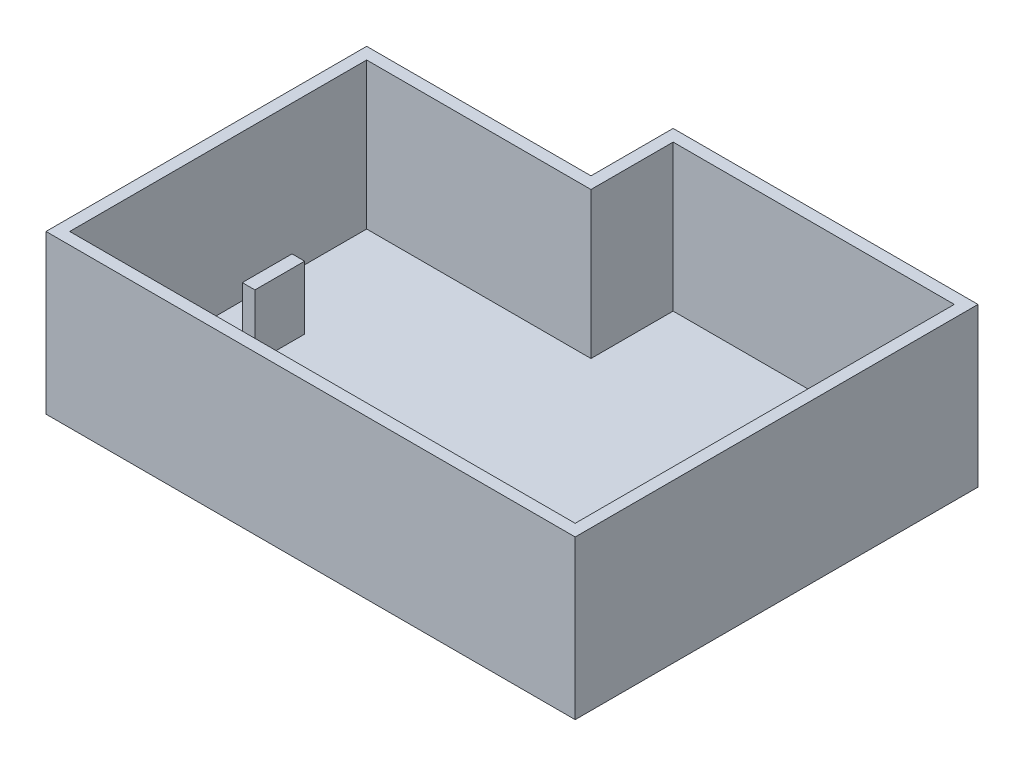
ISO-10303-21;
HEADER;
FILE_DESCRIPTION(('STEP AP214'),'2;1');
FILE_NAME('part.step','',(''),(''),'','','');
FILE_SCHEMA(('AUTOMOTIVE_DESIGN { 1 0 10303 214 1 1 1 1 }'));
ENDSEC;
DATA;
#1=APPLICATION_CONTEXT('core data for automotive mechanical design processes');
#2=APPLICATION_PROTOCOL_DEFINITION('international standard','automotive_design',2000,#1);
#3=PRODUCT_CONTEXT('',#1,'mechanical');
#4=PRODUCT('Part','Part','',(#3));
#5=PRODUCT_RELATED_PRODUCT_CATEGORY('part','',(#4));
#6=PRODUCT_DEFINITION_FORMATION('','',#4);
#7=PRODUCT_DEFINITION_CONTEXT('part definition',#1,'design');
#8=PRODUCT_DEFINITION('design','',#6,#7);
#9=PRODUCT_DEFINITION_SHAPE('','',#8);
#10=(LENGTH_UNIT() NAMED_UNIT(*) SI_UNIT(.MILLI.,.METRE.));
#11=(NAMED_UNIT(*) PLANE_ANGLE_UNIT() SI_UNIT($,.RADIAN.));
#12=(NAMED_UNIT(*) SI_UNIT($,.STERADIAN.) SOLID_ANGLE_UNIT());
#13=UNCERTAINTY_MEASURE_WITH_UNIT(LENGTH_MEASURE(1.E-05),#10,'distance_accuracy_value','');
#14=(GEOMETRIC_REPRESENTATION_CONTEXT(3) GLOBAL_UNCERTAINTY_ASSIGNED_CONTEXT((#13)) GLOBAL_UNIT_ASSIGNED_CONTEXT((#10,
#11,#12)) REPRESENTATION_CONTEXT('',''));
#15=CARTESIAN_POINT('',(0.,0.,0.));
#16=DIRECTION('',(0.,0.,1.));
#17=DIRECTION('',(1.,0.,0.));
#18=AXIS2_PLACEMENT_3D('',#15,#16,#17);
#19=CARTESIAN_POINT('',(212.725,4.7625,0.));
#20=DIRECTION('',(0.,1.,0.));
#21=DIRECTION('',(0.,0.,1.));
#22=AXIS2_PLACEMENT_3D('',#19,#20,#21);
#23=PLANE('',#22);
#24=DIRECTION('',(1.,0.,0.));
#25=VECTOR('',#24,1.);
#26=CARTESIAN_POINT('',(212.725,4.7625,-10.));
#27=LINE('',#26,#25);
#28=CARTESIAN_POINT('',(290.195,4.7625,-10.));
#29=VERTEX_POINT('',#28);
#30=CARTESIAN_POINT('',(295.275,4.7625,-10.));
#31=VERTEX_POINT('',#30);
#32=EDGE_CURVE('E162',#29,#31,#27,.T.);
#33=ORIENTED_EDGE('',*,*,#32,.T.);
#34=DIRECTION('',(0.,0.,-1.));
#35=VECTOR('',#34,1.);
#36=CARTESIAN_POINT('',(295.275,4.7625,0.));
#37=LINE('',#36,#35);
#38=CARTESIAN_POINT('',(295.275,4.7625,9.99999999999997));
#39=VERTEX_POINT('',#38);
#40=EDGE_CURVE('E169',#39,#31,#37,.T.);
#41=ORIENTED_EDGE('',*,*,#40,.F.);
#42=DIRECTION('',(1.,0.,0.));
#43=VECTOR('',#42,1.);
#44=CARTESIAN_POINT('',(212.725,4.7625,9.99999999999994));
#45=LINE('',#44,#43);
#46=CARTESIAN_POINT('',(290.195,4.7625,9.99999999999997));
#47=VERTEX_POINT('',#46);
#48=EDGE_CURVE('E166',#47,#39,#45,.T.);
#49=ORIENTED_EDGE('',*,*,#48,.F.);
#50=DIRECTION('',(0.,0.,-1.));
#51=VECTOR('',#50,1.);
#52=CARTESIAN_POINT('',(290.195,4.7625,-17.8901525748163));
#53=LINE('',#52,#51);
#54=EDGE_CURVE('E295',#47,#29,#53,.T.);
#55=ORIENTED_EDGE('',*,*,#54,.T.);
#56=EDGE_LOOP('',(#33,#41,#49,#55));
#57=FACE_BOUND('',#56,.T.);
#58=DIRECTION('',(-1.,0.,0.));
#59=VECTOR('',#58,1.);
#60=CARTESIAN_POINT('',(212.725,4.7625,38.575));
#61=LINE('',#60,#59);
#62=CARTESIAN_POINT('',(135.255,4.7625,38.575));
#63=VERTEX_POINT('',#62);
#64=CARTESIAN_POINT('',(130.175,4.7625,38.575));
#65=VERTEX_POINT('',#64);
#66=EDGE_CURVE('E232',#63,#65,#61,.T.);
#67=ORIENTED_EDGE('',*,*,#66,.T.);
#68=DIRECTION('',(0.,0.,-1.));
#69=VECTOR('',#68,1.);
#70=CARTESIAN_POINT('',(130.175,4.7625,0.));
#71=LINE('',#70,#69);
#72=CARTESIAN_POINT('',(130.175,4.7625,18.575));
#73=VERTEX_POINT('',#72);
#74=EDGE_CURVE('E229',#65,#73,#71,.T.);
#75=ORIENTED_EDGE('',*,*,#74,.T.);
#76=DIRECTION('',(-1.,0.,0.));
#77=VECTOR('',#76,1.);
#78=CARTESIAN_POINT('',(212.725,4.7625,18.5749999999999));
#79=LINE('',#78,#77);
#80=CARTESIAN_POINT('',(135.255,4.7625,18.575));
#81=VERTEX_POINT('',#80);
#82=EDGE_CURVE('E225',#81,#73,#79,.T.);
#83=ORIENTED_EDGE('',*,*,#82,.F.);
#84=DIRECTION('',(0.,0.,1.));
#85=VECTOR('',#84,1.);
#86=CARTESIAN_POINT('',(135.255,4.7625,-17.8901525748163));
#87=LINE('',#86,#85);
#88=EDGE_CURVE('E298',#81,#63,#87,.T.);
#89=ORIENTED_EDGE('',*,*,#88,.T.);
#90=EDGE_LOOP('',(#67,#75,#83,#89));
#91=FACE_BOUND('',#90,.T.);
#92=DIRECTION('',(0.,0.,-1.));
#93=VECTOR('',#92,1.);
#94=CARTESIAN_POINT('',(222.725,4.7625,0.));
#95=LINE('',#94,#93);
#96=CARTESIAN_POINT('',(222.725,4.7625,69.85));
#97=VERTEX_POINT('',#96);
#98=CARTESIAN_POINT('',(222.725,4.7625,64.77));
#99=VERTEX_POINT('',#98);
#100=EDGE_CURVE('E193',#97,#99,#95,.T.);
#101=ORIENTED_EDGE('',*,*,#100,.F.);
#102=DIRECTION('',(-1.,0.,0.));
#103=VECTOR('',#102,1.);
#104=CARTESIAN_POINT('',(212.725,4.7625,69.85));
#105=LINE('',#104,#103);
#106=CARTESIAN_POINT('',(202.725,4.7625,69.85));
#107=VERTEX_POINT('',#106);
#108=EDGE_CURVE('E200',#97,#107,#105,.T.);
#109=ORIENTED_EDGE('',*,*,#108,.T.);
#110=DIRECTION('',(0.,0.,-1.));
#111=VECTOR('',#110,1.);
#112=CARTESIAN_POINT('',(202.725,4.7625,0.));
#113=LINE('',#112,#111);
#114=CARTESIAN_POINT('',(202.725,4.7625,64.77));
#115=VERTEX_POINT('',#114);
#116=EDGE_CURVE('E197',#107,#115,#113,.T.);
#117=ORIENTED_EDGE('',*,*,#116,.T.);
#118=DIRECTION('',(1.,0.,0.));
#119=VECTOR('',#118,1.);
#120=CARTESIAN_POINT('',(290.195,4.7625,64.77));
#121=LINE('',#120,#119);
#122=EDGE_CURVE('E284',#115,#99,#121,.T.);
#123=ORIENTED_EDGE('',*,*,#122,.T.);
#124=EDGE_LOOP('',(#101,#109,#117,#123));
#125=FACE_BOUND('',#124,.T.);
#126=DIRECTION('',(0.,0.,1.));
#127=VECTOR('',#126,1.);
#128=CARTESIAN_POINT('',(201.295,4.7625,0.));
#129=LINE('',#128,#127);
#130=CARTESIAN_POINT('',(201.295,4.7625,-63.5));
#131=VERTEX_POINT('',#130);
#132=CARTESIAN_POINT('',(201.295,4.7625,-30.48));
#133=VERTEX_POINT('',#132);
#134=EDGE_CURVE('E248',#131,#133,#129,.T.);
#135=ORIENTED_EDGE('',*,*,#134,.T.);
#136=DIRECTION('',(-1.,0.,0.));
#137=VECTOR('',#136,1.);
#138=CARTESIAN_POINT('',(212.725,4.7625,-30.48));
#139=LINE('',#138,#137);
#140=CARTESIAN_POINT('',(111.125,4.7625,-30.48));
#141=VERTEX_POINT('',#140);
#142=EDGE_CURVE('E235',#133,#141,#139,.T.);
#143=ORIENTED_EDGE('',*,*,#142,.T.);
#144=DIRECTION('',(0.,0.,-1.));
#145=VECTOR('',#144,1.);
#146=CARTESIAN_POINT('',(111.125,4.7625,0.));
#147=LINE('',#146,#145);
#148=CARTESIAN_POINT('',(111.125,4.7625,88.9));
#149=VERTEX_POINT('',#148);
#150=EDGE_CURVE('E133',#149,#141,#147,.T.);
#151=ORIENTED_EDGE('',*,*,#150,.F.);
#152=DIRECTION('',(-1.,0.,0.));
#153=VECTOR('',#152,1.);
#154=CARTESIAN_POINT('',(212.725,4.7625,88.9));
#155=LINE('',#154,#153);
#156=CARTESIAN_POINT('',(314.325,4.7625,88.9));
#157=VERTEX_POINT('',#156);
#158=EDGE_CURVE('E136',#157,#149,#155,.T.);
#159=ORIENTED_EDGE('',*,*,#158,.F.);
#160=DIRECTION('',(0.,0.,-1.));
#161=VECTOR('',#160,1.);
#162=CARTESIAN_POINT('',(314.325,4.7625,0.));
#163=LINE('',#162,#161);
#164=CARTESIAN_POINT('',(314.325,4.7625,-63.5));
#165=VERTEX_POINT('',#164);
#166=EDGE_CURVE('E141',#157,#165,#163,.T.);
#167=ORIENTED_EDGE('',*,*,#166,.T.);
#168=DIRECTION('',(-1.,0.,0.));
#169=VECTOR('',#168,1.);
#170=CARTESIAN_POINT('',(212.725,4.7625,-63.5));
#171=LINE('',#170,#169);
#172=EDGE_CURVE('E146',#165,#131,#171,.T.);
#173=ORIENTED_EDGE('',*,*,#172,.T.);
#174=EDGE_LOOP('',(#135,#143,#151,#159,#167,#173));
#175=FACE_BOUND('',#174,.T.);
#176=ADVANCED_FACE('F40',(#57,#91,#125,#175),#23,.T.);
#177=CARTESIAN_POINT('',(212.725,63.607999784,0.));
#178=DIRECTION('',(0.,1.,0.));
#179=DIRECTION('',(0.,0.,1.));
#180=AXIS2_PLACEMENT_3D('',#177,#178,#179);
#181=PLANE('',#180);
#182=DIRECTION('',(0.,0.,-1.));
#183=VECTOR('',#182,1.);
#184=CARTESIAN_POINT('',(196.5325,63.607999784,-93.6625));
#185=LINE('',#184,#183);
#186=CARTESIAN_POINT('',(196.5325,63.607999784,-35.2425));
#187=VERTEX_POINT('',#186);
#188=CARTESIAN_POINT('',(196.5325,63.607999784,-68.2625));
#189=VERTEX_POINT('',#188);
#190=EDGE_CURVE('E251',#187,#189,#185,.T.);
#191=ORIENTED_EDGE('',*,*,#190,.F.);
#192=DIRECTION('',(1.,0.,0.));
#193=VECTOR('',#192,1.);
#194=CARTESIAN_POINT('',(196.5325,63.607999784,-35.2425));
#195=LINE('',#194,#193);
#196=CARTESIAN_POINT('',(106.3625,63.607999784,-35.2425));
#197=VERTEX_POINT('',#196);
#198=EDGE_CURVE('E268',#197,#187,#195,.T.);
#199=ORIENTED_EDGE('',*,*,#198,.F.);
#200=DIRECTION('',(0.,0.,-1.));
#201=VECTOR('',#200,1.);
#202=CARTESIAN_POINT('',(106.3625,63.607999784,0.));
#203=LINE('',#202,#201);
#204=CARTESIAN_POINT('',(106.3625,63.607999784,93.6625));
#205=VERTEX_POINT('',#204);
#206=EDGE_CURVE('E82',#205,#197,#203,.T.);
#207=ORIENTED_EDGE('',*,*,#206,.F.);
#208=DIRECTION('',(-1.,0.,0.));
#209=VECTOR('',#208,1.);
#210=CARTESIAN_POINT('',(212.725,63.607999784,93.6625));
#211=LINE('',#210,#209);
#212=CARTESIAN_POINT('',(319.0875,63.607999784,93.6625));
#213=VERTEX_POINT('',#212);
#214=EDGE_CURVE('E80',#213,#205,#211,.T.);
#215=ORIENTED_EDGE('',*,*,#214,.F.);
#216=DIRECTION('',(0.,0.,-1.));
#217=VECTOR('',#216,1.);
#218=CARTESIAN_POINT('',(319.0875,63.607999784,0.));
#219=LINE('',#218,#217);
#220=CARTESIAN_POINT('',(319.0875,63.607999784,-68.2625));
#221=VERTEX_POINT('',#220);
#222=EDGE_CURVE('E94',#213,#221,#219,.T.);
#223=ORIENTED_EDGE('',*,*,#222,.T.);
#224=DIRECTION('',(1.,0.,0.));
#225=VECTOR('',#224,1.);
#226=CARTESIAN_POINT('',(319.0875,63.607999784,-68.2625));
#227=LINE('',#226,#225);
#228=EDGE_CURVE('E288',#189,#221,#227,.T.);
#229=ORIENTED_EDGE('',*,*,#228,.F.);
#230=EDGE_LOOP('',(#191,#199,#207,#215,#223,#229));
#231=FACE_BOUND('',#230,.T.);
#232=DIRECTION('',(-1.,0.,0.));
#233=VECTOR('',#232,1.);
#234=CARTESIAN_POINT('',(319.0875,63.607999784,-63.5));
#235=LINE('',#234,#233);
#236=CARTESIAN_POINT('',(314.325,63.607999784,-63.5));
#237=VERTEX_POINT('',#236);
#238=CARTESIAN_POINT('',(201.295,63.607999784,-63.5));
#239=VERTEX_POINT('',#238);
#240=EDGE_CURVE('E281',#237,#239,#235,.T.);
#241=ORIENTED_EDGE('',*,*,#240,.F.);
#242=DIRECTION('',(0.,0.,-1.));
#243=VECTOR('',#242,1.);
#244=CARTESIAN_POINT('',(314.325,63.607999784,0.));
#245=LINE('',#244,#243);
#246=CARTESIAN_POINT('',(314.325,63.607999784,88.9));
#247=VERTEX_POINT('',#246);
#248=EDGE_CURVE('E130',#247,#237,#245,.T.);
#249=ORIENTED_EDGE('',*,*,#248,.F.);
#250=DIRECTION('',(-1.,0.,0.));
#251=VECTOR('',#250,1.);
#252=CARTESIAN_POINT('',(212.725,63.607999784,88.9));
#253=LINE('',#252,#251);
#254=CARTESIAN_POINT('',(111.125,63.607999784,88.9));
#255=VERTEX_POINT('',#254);
#256=EDGE_CURVE('E127',#247,#255,#253,.T.);
#257=ORIENTED_EDGE('',*,*,#256,.T.);
#258=DIRECTION('',(0.,0.,-1.));
#259=VECTOR('',#258,1.);
#260=CARTESIAN_POINT('',(111.125,63.607999784,0.));
#261=LINE('',#260,#259);
#262=CARTESIAN_POINT('',(111.125,63.607999784,-30.48));
#263=VERTEX_POINT('',#262);
#264=EDGE_CURVE('E123',#255,#263,#261,.T.);
#265=ORIENTED_EDGE('',*,*,#264,.T.);
#266=DIRECTION('',(-1.,0.,0.));
#267=VECTOR('',#266,1.);
#268=CARTESIAN_POINT('',(106.3625,63.607999784,-30.48));
#269=LINE('',#268,#267);
#270=CARTESIAN_POINT('',(201.295,63.607999784,-30.48));
#271=VERTEX_POINT('',#270);
#272=EDGE_CURVE('E265',#271,#263,#269,.T.);
#273=ORIENTED_EDGE('',*,*,#272,.F.);
#274=DIRECTION('',(0.,0.,1.));
#275=VECTOR('',#274,1.);
#276=CARTESIAN_POINT('',(201.295,63.607999784,-30.48));
#277=LINE('',#276,#275);
#278=EDGE_CURVE('E262',#239,#271,#277,.T.);
#279=ORIENTED_EDGE('',*,*,#278,.F.);
#280=EDGE_LOOP('',(#241,#249,#257,#265,#273,#279));
#281=FACE_BOUND('',#280,.T.);
#282=ADVANCED_FACE('F118',(#231,#281),#181,.T.);
#283=CARTESIAN_POINT('',(319.0875,63.607999784,0.));
#284=DIRECTION('',(1.,0.,0.));
#285=DIRECTION('',(0.,0.,1.));
#286=AXIS2_PLACEMENT_3D('',#283,#284,#285);
#287=PLANE('',#286);
#288=ORIENTED_EDGE('',*,*,#222,.F.);
#289=DIRECTION('',(0.,-1.,0.));
#290=VECTOR('',#289,1.);
#291=CARTESIAN_POINT('',(319.0875,63.607999784,93.6625));
#292=LINE('',#291,#290);
#293=CARTESIAN_POINT('',(319.0875,0.,93.6625));
#294=VERTEX_POINT('',#293);
#295=EDGE_CURVE('E48',#213,#294,#292,.T.);
#296=ORIENTED_EDGE('',*,*,#295,.T.);
#297=DIRECTION('',(0.,0.,-1.));
#298=VECTOR('',#297,1.);
#299=CARTESIAN_POINT('',(319.0875,0.,0.));
#300=LINE('',#299,#298);
#301=CARTESIAN_POINT('',(319.0875,0.,-68.2625));
#302=VERTEX_POINT('',#301);
#303=EDGE_CURVE('E99',#294,#302,#300,.T.);
#304=ORIENTED_EDGE('',*,*,#303,.T.);
#305=DIRECTION('',(0.,-1.,0.));
#306=VECTOR('',#305,1.);
#307=CARTESIAN_POINT('',(319.0875,186.255500497427,-68.2625));
#308=LINE('',#307,#306);
#309=EDGE_CURVE('E112',#221,#302,#308,.T.);
#310=ORIENTED_EDGE('',*,*,#309,.F.);
#311=EDGE_LOOP('',(#288,#296,#304,#310));
#312=FACE_BOUND('',#311,.T.);
#313=ADVANCED_FACE('F42',(#312),#287,.T.);
#314=CARTESIAN_POINT('',(212.725,0.,0.));
#315=DIRECTION('',(0.,1.,0.));
#316=DIRECTION('',(0.,0.,1.));
#317=AXIS2_PLACEMENT_3D('',#314,#315,#316);
#318=PLANE('',#317);
#319=ORIENTED_EDGE('',*,*,#303,.F.);
#320=DIRECTION('',(-1.,0.,0.));
#321=VECTOR('',#320,1.);
#322=CARTESIAN_POINT('',(212.725,0.,93.6625));
#323=LINE('',#322,#321);
#324=CARTESIAN_POINT('',(106.3625,0.,93.6625));
#325=VERTEX_POINT('',#324);
#326=EDGE_CURVE('E77',#294,#325,#323,.T.);
#327=ORIENTED_EDGE('',*,*,#326,.T.);
#328=DIRECTION('',(0.,0.,-1.));
#329=VECTOR('',#328,1.);
#330=CARTESIAN_POINT('',(106.3625,0.,0.));
#331=LINE('',#330,#329);
#332=CARTESIAN_POINT('',(106.3625,0.,-35.2425));
#333=VERTEX_POINT('',#332);
#334=EDGE_CURVE('E86',#325,#333,#331,.T.);
#335=ORIENTED_EDGE('',*,*,#334,.T.);
#336=DIRECTION('',(1.,0.,0.));
#337=VECTOR('',#336,1.);
#338=CARTESIAN_POINT('',(196.5325,0.,-35.2425));
#339=LINE('',#338,#337);
#340=CARTESIAN_POINT('',(196.5325,0.,-35.2425));
#341=VERTEX_POINT('',#340);
#342=EDGE_CURVE('E256',#333,#341,#339,.T.);
#343=ORIENTED_EDGE('',*,*,#342,.T.);
#344=DIRECTION('',(0.,0.,-1.));
#345=VECTOR('',#344,1.);
#346=CARTESIAN_POINT('',(196.5325,0.,-93.6625));
#347=LINE('',#346,#345);
#348=CARTESIAN_POINT('',(196.5325,0.,-68.2625));
#349=VERTEX_POINT('',#348);
#350=EDGE_CURVE('E255',#341,#349,#347,.T.);
#351=ORIENTED_EDGE('',*,*,#350,.T.);
#352=DIRECTION('',(1.,0.,0.));
#353=VECTOR('',#352,1.);
#354=CARTESIAN_POINT('',(319.0875,0.,-68.2625));
#355=LINE('',#354,#353);
#356=EDGE_CURVE('E287',#349,#302,#355,.T.);
#357=ORIENTED_EDGE('',*,*,#356,.T.);
#358=EDGE_LOOP('',(#319,#327,#335,#343,#351,#357));
#359=FACE_BOUND('',#358,.T.);
#360=ADVANCED_FACE('F96',(#359),#318,.F.);
#361=CARTESIAN_POINT('',(314.325,63.607999784,0.));
#362=DIRECTION('',(1.,0.,0.));
#363=DIRECTION('',(0.,0.,1.));
#364=AXIS2_PLACEMENT_3D('',#361,#362,#363);
#365=PLANE('',#364);
#366=DIRECTION('',(0.,-1.,0.));
#367=VECTOR('',#366,1.);
#368=CARTESIAN_POINT('',(314.325,63.607999784,-63.5));
#369=LINE('',#368,#367);
#370=EDGE_CURVE('E261',#237,#165,#369,.T.);
#371=ORIENTED_EDGE('',*,*,#370,.T.);
#372=ORIENTED_EDGE('',*,*,#166,.F.);
#373=DIRECTION('',(0.,-1.,0.));
#374=VECTOR('',#373,1.);
#375=CARTESIAN_POINT('',(314.325,63.607999784,88.9));
#376=LINE('',#375,#374);
#377=EDGE_CURVE('E102',#247,#157,#376,.T.);
#378=ORIENTED_EDGE('',*,*,#377,.F.);
#379=ORIENTED_EDGE('',*,*,#248,.T.);
#380=EDGE_LOOP('',(#371,#372,#378,#379));
#381=FACE_BOUND('',#380,.T.);
#382=ADVANCED_FACE('F381',(#381),#365,.F.);
#383=CARTESIAN_POINT('',(201.295,177.643993498704,-30.48));
#384=DIRECTION('',(-1.,0.,0.));
#385=DIRECTION('',(0.,0.,-1.));
#386=AXIS2_PLACEMENT_3D('',#383,#384,#385);
#387=PLANE('',#386);
#388=DIRECTION('',(0.,1.,0.));
#389=VECTOR('',#388,1.);
#390=CARTESIAN_POINT('',(201.295,177.643993498704,-63.5));
#391=LINE('',#390,#389);
#392=EDGE_CURVE('E278',#131,#239,#391,.T.);
#393=ORIENTED_EDGE('',*,*,#392,.T.);
#394=ORIENTED_EDGE('',*,*,#278,.T.);
#395=DIRECTION('',(0.,-1.,0.));
#396=VECTOR('',#395,1.);
#397=CARTESIAN_POINT('',(201.295,177.643993498704,-30.48));
#398=LINE('',#397,#396);
#399=EDGE_CURVE('E258',#271,#133,#398,.T.);
#400=ORIENTED_EDGE('',*,*,#399,.T.);
#401=ORIENTED_EDGE('',*,*,#134,.F.);
#402=EDGE_LOOP('',(#393,#394,#400,#401));
#403=FACE_BOUND('',#402,.T.);
#404=ADVANCED_FACE('F471',(#403),#387,.F.);
#405=CARTESIAN_POINT('',(196.5325,177.643993498704,-93.6625));
#406=DIRECTION('',(1.,0.,0.));
#407=DIRECTION('',(0.,0.,1.));
#408=AXIS2_PLACEMENT_3D('',#405,#406,#407);
#409=PLANE('',#408);
#410=ORIENTED_EDGE('',*,*,#350,.F.);
#411=DIRECTION('',(0.,-1.,0.));
#412=VECTOR('',#411,1.);
#413=CARTESIAN_POINT('',(196.5325,177.643993498704,-35.2425));
#414=LINE('',#413,#412);
#415=EDGE_CURVE('E252',#187,#341,#414,.T.);
#416=ORIENTED_EDGE('',*,*,#415,.F.);
#417=ORIENTED_EDGE('',*,*,#190,.T.);
#418=DIRECTION('',(0.,-1.,0.));
#419=VECTOR('',#418,1.);
#420=CARTESIAN_POINT('',(196.5325,186.255500497427,-68.2625));
#421=LINE('',#420,#419);
#422=EDGE_CURVE('E283',#189,#349,#421,.T.);
#423=ORIENTED_EDGE('',*,*,#422,.T.);
#424=EDGE_LOOP('',(#410,#416,#417,#423));
#425=FACE_BOUND('',#424,.T.);
#426=ADVANCED_FACE('F437',(#425),#409,.F.);
#427=CARTESIAN_POINT('',(212.725,63.607999784,93.6625));
#428=DIRECTION('',(0.,0.,-1.));
#429=DIRECTION('',(1.,0.,0.));
#430=AXIS2_PLACEMENT_3D('',#427,#428,#429);
#431=PLANE('',#430);
#432=ORIENTED_EDGE('',*,*,#326,.F.);
#433=ORIENTED_EDGE('',*,*,#295,.F.);
#434=ORIENTED_EDGE('',*,*,#214,.T.);
#435=DIRECTION('',(0.,-1.,0.));
#436=VECTOR('',#435,1.);
#437=CARTESIAN_POINT('',(106.3625,63.607999784,93.6625));
#438=LINE('',#437,#436);
#439=EDGE_CURVE('E64',#205,#325,#438,.T.);
#440=ORIENTED_EDGE('',*,*,#439,.T.);
#441=EDGE_LOOP('',(#432,#433,#434,#440));
#442=FACE_BOUND('',#441,.T.);
#443=ADVANCED_FACE('F75',(#442),#431,.F.);
#444=CARTESIAN_POINT('',(106.3625,63.607999784,0.));
#445=DIRECTION('',(1.,0.,0.));
#446=DIRECTION('',(0.,0.,1.));
#447=AXIS2_PLACEMENT_3D('',#444,#445,#446);
#448=PLANE('',#447);
#449=ORIENTED_EDGE('',*,*,#334,.F.);
#450=ORIENTED_EDGE('',*,*,#439,.F.);
#451=ORIENTED_EDGE('',*,*,#206,.T.);
#452=DIRECTION('',(0.,-1.,0.));
#453=VECTOR('',#452,1.);
#454=CARTESIAN_POINT('',(106.3625,177.643993498704,-35.2425));
#455=LINE('',#454,#453);
#456=EDGE_CURVE('E90',#197,#333,#455,.T.);
#457=ORIENTED_EDGE('',*,*,#456,.T.);
#458=EDGE_LOOP('',(#449,#450,#451,#457));
#459=FACE_BOUND('',#458,.T.);
#460=ADVANCED_FACE('F87',(#459),#448,.F.);
#461=CARTESIAN_POINT('',(212.725,63.607999784,88.9));
#462=DIRECTION('',(0.,0.,-1.));
#463=DIRECTION('',(1.,0.,0.));
#464=AXIS2_PLACEMENT_3D('',#461,#462,#463);
#465=PLANE('',#464);
#466=ORIENTED_EDGE('',*,*,#158,.T.);
#467=DIRECTION('',(0.,-1.,0.));
#468=VECTOR('',#467,1.);
#469=CARTESIAN_POINT('',(111.125,63.607999784,88.9));
#470=LINE('',#469,#468);
#471=EDGE_CURVE('E126',#255,#149,#470,.T.);
#472=ORIENTED_EDGE('',*,*,#471,.F.);
#473=ORIENTED_EDGE('',*,*,#256,.F.);
#474=ORIENTED_EDGE('',*,*,#377,.T.);
#475=EDGE_LOOP('',(#466,#472,#473,#474));
#476=FACE_BOUND('',#475,.T.);
#477=ADVANCED_FACE('F368',(#476),#465,.T.);
#478=CARTESIAN_POINT('',(111.125,63.607999784,0.));
#479=DIRECTION('',(1.,0.,0.));
#480=DIRECTION('',(0.,0.,1.));
#481=AXIS2_PLACEMENT_3D('',#478,#479,#480);
#482=PLANE('',#481);
#483=DIRECTION('',(0.,1.,0.));
#484=VECTOR('',#483,1.);
#485=CARTESIAN_POINT('',(111.125,63.607999784,-30.48));
#486=LINE('',#485,#484);
#487=EDGE_CURVE('E11',#141,#263,#486,.T.);
#488=ORIENTED_EDGE('',*,*,#487,.T.);
#489=ORIENTED_EDGE('',*,*,#264,.F.);
#490=ORIENTED_EDGE('',*,*,#471,.T.);
#491=ORIENTED_EDGE('',*,*,#150,.T.);
#492=EDGE_LOOP('',(#488,#489,#490,#491));
#493=FACE_BOUND('',#492,.T.);
#494=ADVANCED_FACE('F373',(#493),#482,.T.);
#495=CARTESIAN_POINT('',(295.275,30.1625,0.));
#496=DIRECTION('',(1.,0.,0.));
#497=DIRECTION('',(0.,0.,1.));
#498=AXIS2_PLACEMENT_3D('',#495,#496,#497);
#499=PLANE('',#498);
#500=ORIENTED_EDGE('',*,*,#40,.T.);
#501=DIRECTION('',(0.,-1.,0.));
#502=VECTOR('',#501,1.);
#503=CARTESIAN_POINT('',(295.275,30.1625,-10.));
#504=LINE('',#503,#502);
#505=CARTESIAN_POINT('',(295.275,30.1625,-10.));
#506=VERTEX_POINT('',#505);
#507=EDGE_CURVE('E158',#506,#31,#504,.T.);
#508=ORIENTED_EDGE('',*,*,#507,.F.);
#509=DIRECTION('',(0.,0.,-1.));
#510=VECTOR('',#509,1.);
#511=CARTESIAN_POINT('',(295.275,30.1625,0.));
#512=LINE('',#511,#510);
#513=CARTESIAN_POINT('',(295.275,30.1625,9.99999999999997));
#514=VERTEX_POINT('',#513);
#515=EDGE_CURVE('E165',#514,#506,#512,.T.);
#516=ORIENTED_EDGE('',*,*,#515,.F.);
#517=DIRECTION('',(0.,-1.,0.));
#518=VECTOR('',#517,1.);
#519=CARTESIAN_POINT('',(295.275,30.1625,9.99999999999997));
#520=LINE('',#519,#518);
#521=EDGE_CURVE('E149',#514,#39,#520,.T.);
#522=ORIENTED_EDGE('',*,*,#521,.T.);
#523=EDGE_LOOP('',(#500,#508,#516,#522));
#524=FACE_BOUND('',#523,.T.);
#525=ADVANCED_FACE('F632',(#524),#499,.T.);
#526=CARTESIAN_POINT('',(212.725,30.1625,9.99999999999994));
#527=DIRECTION('',(0.,0.,1.));
#528=DIRECTION('',(-1.,0.,0.));
#529=AXIS2_PLACEMENT_3D('',#526,#527,#528);
#530=PLANE('',#529);
#531=ORIENTED_EDGE('',*,*,#48,.T.);
#532=ORIENTED_EDGE('',*,*,#521,.F.);
#533=DIRECTION('',(1.,0.,0.));
#534=VECTOR('',#533,1.);
#535=CARTESIAN_POINT('',(212.725,30.1625,9.99999999999994));
#536=LINE('',#535,#534);
#537=CARTESIAN_POINT('',(290.195,30.1625,9.99999999999997));
#538=VERTEX_POINT('',#537);
#539=EDGE_CURVE('E177',#538,#514,#536,.T.);
#540=ORIENTED_EDGE('',*,*,#539,.F.);
#541=DIRECTION('',(0.,-1.,0.));
#542=VECTOR('',#541,1.);
#543=CARTESIAN_POINT('',(290.195,30.1625,9.99999999999997));
#544=LINE('',#543,#542);
#545=EDGE_CURVE('E152',#538,#47,#544,.T.);
#546=ORIENTED_EDGE('',*,*,#545,.T.);
#547=EDGE_LOOP('',(#531,#532,#540,#546));
#548=FACE_BOUND('',#547,.T.);
#549=ADVANCED_FACE('F621',(#548),#530,.T.);
#550=CARTESIAN_POINT('',(290.195,30.1625,0.));
#551=DIRECTION('',(-1.,0.,0.));
#552=DIRECTION('',(0.,0.,-1.));
#553=AXIS2_PLACEMENT_3D('',#550,#551,#552);
#554=PLANE('',#553);
#555=ORIENTED_EDGE('',*,*,#545,.F.);
#556=DIRECTION('',(0.,0.,1.));
#557=VECTOR('',#556,1.);
#558=CARTESIAN_POINT('',(290.195,30.1625,0.));
#559=LINE('',#558,#557);
#560=CARTESIAN_POINT('',(290.195,30.1625,-10.));
#561=VERTEX_POINT('',#560);
#562=EDGE_CURVE('E174',#561,#538,#559,.T.);
#563=ORIENTED_EDGE('',*,*,#562,.F.);
#564=DIRECTION('',(0.,-1.,0.));
#565=VECTOR('',#564,1.);
#566=CARTESIAN_POINT('',(290.195,30.1625,-10.));
#567=LINE('',#566,#565);
#568=EDGE_CURVE('E155',#561,#29,#567,.T.);
#569=ORIENTED_EDGE('',*,*,#568,.T.);
#570=ORIENTED_EDGE('',*,*,#54,.F.);
#571=EDGE_LOOP('',(#555,#563,#569,#570));
#572=FACE_BOUND('',#571,.T.);
#573=ADVANCED_FACE('F610',(#572),#554,.T.);
#574=CARTESIAN_POINT('',(212.725,30.1625,-10.));
#575=DIRECTION('',(0.,0.,1.));
#576=DIRECTION('',(-1.,0.,0.));
#577=AXIS2_PLACEMENT_3D('',#574,#575,#576);
#578=PLANE('',#577);
#579=ORIENTED_EDGE('',*,*,#568,.F.);
#580=DIRECTION('',(1.,0.,0.));
#581=VECTOR('',#580,1.);
#582=CARTESIAN_POINT('',(212.725,30.1625,-10.));
#583=LINE('',#582,#581);
#584=EDGE_CURVE('E161',#561,#506,#583,.T.);
#585=ORIENTED_EDGE('',*,*,#584,.T.);
#586=ORIENTED_EDGE('',*,*,#507,.T.);
#587=ORIENTED_EDGE('',*,*,#32,.F.);
#588=EDGE_LOOP('',(#579,#585,#586,#587));
#589=FACE_BOUND('',#588,.T.);
#590=ADVANCED_FACE('F600',(#589),#578,.F.);
#591=CARTESIAN_POINT('',(212.725,30.1625,0.));
#592=DIRECTION('',(0.,1.,0.));
#593=DIRECTION('',(0.,0.,1.));
#594=AXIS2_PLACEMENT_3D('',#591,#592,#593);
#595=PLANE('',#594);
#596=ORIENTED_EDGE('',*,*,#515,.T.);
#597=ORIENTED_EDGE('',*,*,#584,.F.);
#598=ORIENTED_EDGE('',*,*,#562,.T.);
#599=ORIENTED_EDGE('',*,*,#539,.T.);
#600=EDGE_LOOP('',(#596,#597,#598,#599));
#601=FACE_BOUND('',#600,.T.);
#602=ADVANCED_FACE('F591',(#601),#595,.T.);
#603=CARTESIAN_POINT('',(212.725,30.1625,69.85));
#604=DIRECTION('',(0.,0.,-1.));
#605=DIRECTION('',(1.,0.,0.));
#606=AXIS2_PLACEMENT_3D('',#603,#604,#605);
#607=PLANE('',#606);
#608=ORIENTED_EDGE('',*,*,#108,.F.);
#609=DIRECTION('',(0.,-1.,0.));
#610=VECTOR('',#609,1.);
#611=CARTESIAN_POINT('',(222.725,30.1625,69.85));
#612=LINE('',#611,#610);
#613=CARTESIAN_POINT('',(222.725,30.1625,69.85));
#614=VERTEX_POINT('',#613);
#615=EDGE_CURVE('E189',#614,#97,#612,.T.);
#616=ORIENTED_EDGE('',*,*,#615,.F.);
#617=DIRECTION('',(-1.,0.,0.));
#618=VECTOR('',#617,1.);
#619=CARTESIAN_POINT('',(212.725,30.1625,69.85));
#620=LINE('',#619,#618);
#621=CARTESIAN_POINT('',(202.725,30.1625,69.85));
#622=VERTEX_POINT('',#621);
#623=EDGE_CURVE('E196',#614,#622,#620,.T.);
#624=ORIENTED_EDGE('',*,*,#623,.T.);
#625=DIRECTION('',(0.,-1.,0.));
#626=VECTOR('',#625,1.);
#627=CARTESIAN_POINT('',(202.725,30.1625,69.85));
#628=LINE('',#627,#626);
#629=EDGE_CURVE('E55',#622,#107,#628,.T.);
#630=ORIENTED_EDGE('',*,*,#629,.T.);
#631=EDGE_LOOP('',(#608,#616,#624,#630));
#632=FACE_BOUND('',#631,.T.);
#633=ADVANCED_FACE('F580',(#632),#607,.F.);
#634=CARTESIAN_POINT('',(202.725,30.1625,0.));
#635=DIRECTION('',(1.,0.,0.));
#636=DIRECTION('',(0.,0.,1.));
#637=AXIS2_PLACEMENT_3D('',#634,#635,#636);
#638=PLANE('',#637);
#639=ORIENTED_EDGE('',*,*,#116,.F.);
#640=ORIENTED_EDGE('',*,*,#629,.F.);
#641=DIRECTION('',(0.,0.,-1.));
#642=VECTOR('',#641,1.);
#643=CARTESIAN_POINT('',(202.725,30.1625,0.));
#644=LINE('',#643,#642);
#645=CARTESIAN_POINT('',(202.725,30.1625,64.77));
#646=VERTEX_POINT('',#645);
#647=EDGE_CURVE('E209',#622,#646,#644,.T.);
#648=ORIENTED_EDGE('',*,*,#647,.T.);
#649=DIRECTION('',(0.,-1.,0.));
#650=VECTOR('',#649,1.);
#651=CARTESIAN_POINT('',(202.725,30.1625,64.77));
#652=LINE('',#651,#650);
#653=EDGE_CURVE('E183',#646,#115,#652,.T.);
#654=ORIENTED_EDGE('',*,*,#653,.T.);
#655=EDGE_LOOP('',(#639,#640,#648,#654));
#656=FACE_BOUND('',#655,.T.);
#657=ADVANCED_FACE('F569',(#656),#638,.F.);
#658=CARTESIAN_POINT('',(212.725,30.1625,64.77));
#659=DIRECTION('',(0.,0.,1.));
#660=DIRECTION('',(-1.,0.,0.));
#661=AXIS2_PLACEMENT_3D('',#658,#659,#660);
#662=PLANE('',#661);
#663=ORIENTED_EDGE('',*,*,#653,.F.);
#664=DIRECTION('',(1.,0.,0.));
#665=VECTOR('',#664,1.);
#666=CARTESIAN_POINT('',(212.725,30.1625,64.77));
#667=LINE('',#666,#665);
#668=CARTESIAN_POINT('',(222.725,30.1625,64.77));
#669=VERTEX_POINT('',#668);
#670=EDGE_CURVE('E206',#646,#669,#667,.T.);
#671=ORIENTED_EDGE('',*,*,#670,.T.);
#672=DIRECTION('',(0.,-1.,0.));
#673=VECTOR('',#672,1.);
#674=CARTESIAN_POINT('',(222.725,30.1625,64.77));
#675=LINE('',#674,#673);
#676=EDGE_CURVE('E186',#669,#99,#675,.T.);
#677=ORIENTED_EDGE('',*,*,#676,.T.);
#678=ORIENTED_EDGE('',*,*,#122,.F.);
#679=EDGE_LOOP('',(#663,#671,#677,#678));
#680=FACE_BOUND('',#679,.T.);
#681=ADVANCED_FACE('F558',(#680),#662,.F.);
#682=CARTESIAN_POINT('',(222.725,30.1625,0.));
#683=DIRECTION('',(1.,0.,0.));
#684=DIRECTION('',(0.,0.,1.));
#685=AXIS2_PLACEMENT_3D('',#682,#683,#684);
#686=PLANE('',#685);
#687=ORIENTED_EDGE('',*,*,#676,.F.);
#688=DIRECTION('',(0.,0.,-1.));
#689=VECTOR('',#688,1.);
#690=CARTESIAN_POINT('',(222.725,30.1625,0.));
#691=LINE('',#690,#689);
#692=EDGE_CURVE('E192',#614,#669,#691,.T.);
#693=ORIENTED_EDGE('',*,*,#692,.F.);
#694=ORIENTED_EDGE('',*,*,#615,.T.);
#695=ORIENTED_EDGE('',*,*,#100,.T.);
#696=EDGE_LOOP('',(#687,#693,#694,#695));
#697=FACE_BOUND('',#696,.T.);
#698=ADVANCED_FACE('F548',(#697),#686,.T.);
#699=CARTESIAN_POINT('',(212.725,30.1625,0.));
#700=DIRECTION('',(0.,1.,0.));
#701=DIRECTION('',(0.,0.,1.));
#702=AXIS2_PLACEMENT_3D('',#699,#700,#701);
#703=PLANE('',#702);
#704=ORIENTED_EDGE('',*,*,#623,.F.);
#705=ORIENTED_EDGE('',*,*,#692,.T.);
#706=ORIENTED_EDGE('',*,*,#670,.F.);
#707=ORIENTED_EDGE('',*,*,#647,.F.);
#708=EDGE_LOOP('',(#704,#705,#706,#707));
#709=FACE_BOUND('',#708,.T.);
#710=ADVANCED_FACE('F538',(#709),#703,.T.);
#711=CARTESIAN_POINT('',(212.725,30.1625,38.575));
#712=DIRECTION('',(0.,0.,-1.));
#713=DIRECTION('',(1.,0.,0.));
#714=AXIS2_PLACEMENT_3D('',#711,#712,#713);
#715=PLANE('',#714);
#716=DIRECTION('',(0.,-1.,0.));
#717=VECTOR('',#716,1.);
#718=CARTESIAN_POINT('',(135.255,30.1625,38.575));
#719=LINE('',#718,#717);
#720=CARTESIAN_POINT('',(135.255,30.1625,38.575));
#721=VERTEX_POINT('',#720);
#722=EDGE_CURVE('E221',#721,#63,#719,.T.);
#723=ORIENTED_EDGE('',*,*,#722,.F.);
#724=DIRECTION('',(-1.,0.,0.));
#725=VECTOR('',#724,1.);
#726=CARTESIAN_POINT('',(212.725,30.1625,38.575));
#727=LINE('',#726,#725);
#728=CARTESIAN_POINT('',(130.175,30.1625,38.575));
#729=VERTEX_POINT('',#728);
#730=EDGE_CURVE('E228',#721,#729,#727,.T.);
#731=ORIENTED_EDGE('',*,*,#730,.T.);
#732=DIRECTION('',(0.,-1.,0.));
#733=VECTOR('',#732,1.);
#734=CARTESIAN_POINT('',(130.175,30.1625,38.575));
#735=LINE('',#734,#733);
#736=EDGE_CURVE('E203',#729,#65,#735,.T.);
#737=ORIENTED_EDGE('',*,*,#736,.T.);
#738=ORIENTED_EDGE('',*,*,#66,.F.);
#739=EDGE_LOOP('',(#723,#731,#737,#738));
#740=FACE_BOUND('',#739,.T.);
#741=ADVANCED_FACE('F314',(#740),#715,.F.);
#742=CARTESIAN_POINT('',(130.175,30.1625,0.));
#743=DIRECTION('',(1.,0.,0.));
#744=DIRECTION('',(0.,0.,1.));
#745=AXIS2_PLACEMENT_3D('',#742,#743,#744);
#746=PLANE('',#745);
#747=ORIENTED_EDGE('',*,*,#74,.F.);
#748=ORIENTED_EDGE('',*,*,#736,.F.);
#749=DIRECTION('',(0.,0.,-1.));
#750=VECTOR('',#749,1.);
#751=CARTESIAN_POINT('',(130.175,30.1625,0.));
#752=LINE('',#751,#750);
#753=CARTESIAN_POINT('',(130.175,30.1625,18.575));
#754=VERTEX_POINT('',#753);
#755=EDGE_CURVE('E241',#729,#754,#752,.T.);
#756=ORIENTED_EDGE('',*,*,#755,.T.);
#757=DIRECTION('',(0.,-1.,0.));
#758=VECTOR('',#757,1.);
#759=CARTESIAN_POINT('',(130.175,30.1625,18.575));
#760=LINE('',#759,#758);
#761=EDGE_CURVE('E215',#754,#73,#760,.T.);
#762=ORIENTED_EDGE('',*,*,#761,.T.);
#763=EDGE_LOOP('',(#747,#748,#756,#762));
#764=FACE_BOUND('',#763,.T.);
#765=ADVANCED_FACE('F324',(#764),#746,.F.);
#766=CARTESIAN_POINT('',(212.725,30.1625,18.5749999999999));
#767=DIRECTION('',(0.,0.,-1.));
#768=DIRECTION('',(1.,0.,0.));
#769=AXIS2_PLACEMENT_3D('',#766,#767,#768);
#770=PLANE('',#769);
#771=ORIENTED_EDGE('',*,*,#82,.T.);
#772=ORIENTED_EDGE('',*,*,#761,.F.);
#773=DIRECTION('',(-1.,0.,0.));
#774=VECTOR('',#773,1.);
#775=CARTESIAN_POINT('',(212.725,30.1625,18.5749999999999));
#776=LINE('',#775,#774);
#777=CARTESIAN_POINT('',(135.255,30.1625,18.575));
#778=VERTEX_POINT('',#777);
#779=EDGE_CURVE('E238',#778,#754,#776,.T.);
#780=ORIENTED_EDGE('',*,*,#779,.F.);
#781=DIRECTION('',(0.,-1.,0.));
#782=VECTOR('',#781,1.);
#783=CARTESIAN_POINT('',(135.255,30.1625,18.575));
#784=LINE('',#783,#782);
#785=EDGE_CURVE('E218',#778,#81,#784,.T.);
#786=ORIENTED_EDGE('',*,*,#785,.T.);
#787=EDGE_LOOP('',(#771,#772,#780,#786));
#788=FACE_BOUND('',#787,.T.);
#789=ADVANCED_FACE('F419',(#788),#770,.T.);
#790=CARTESIAN_POINT('',(135.255,30.1625,0.));
#791=DIRECTION('',(-1.,0.,0.));
#792=DIRECTION('',(0.,0.,-1.));
#793=AXIS2_PLACEMENT_3D('',#790,#791,#792);
#794=PLANE('',#793);
#795=ORIENTED_EDGE('',*,*,#785,.F.);
#796=DIRECTION('',(0.,0.,1.));
#797=VECTOR('',#796,1.);
#798=CARTESIAN_POINT('',(135.255,30.1625,0.));
#799=LINE('',#798,#797);
#800=EDGE_CURVE('E224',#778,#721,#799,.T.);
#801=ORIENTED_EDGE('',*,*,#800,.T.);
#802=ORIENTED_EDGE('',*,*,#722,.T.);
#803=ORIENTED_EDGE('',*,*,#88,.F.);
#804=EDGE_LOOP('',(#795,#801,#802,#803));
#805=FACE_BOUND('',#804,.T.);
#806=ADVANCED_FACE('F414',(#805),#794,.F.);
#807=CARTESIAN_POINT('',(212.725,30.1625,0.));
#808=DIRECTION('',(0.,1.,0.));
#809=DIRECTION('',(0.,0.,1.));
#810=AXIS2_PLACEMENT_3D('',#807,#808,#809);
#811=PLANE('',#810);
#812=ORIENTED_EDGE('',*,*,#730,.F.);
#813=ORIENTED_EDGE('',*,*,#800,.F.);
#814=ORIENTED_EDGE('',*,*,#779,.T.);
#815=ORIENTED_EDGE('',*,*,#755,.F.);
#816=EDGE_LOOP('',(#812,#813,#814,#815));
#817=FACE_BOUND('',#816,.T.);
#818=ADVANCED_FACE('F417',(#817),#811,.T.);
#819=CARTESIAN_POINT('',(106.3625,177.643993498704,-30.48));
#820=DIRECTION('',(0.,0.,-1.));
#821=DIRECTION('',(1.,0.,0.));
#822=AXIS2_PLACEMENT_3D('',#819,#820,#821);
#823=PLANE('',#822);
#824=ORIENTED_EDGE('',*,*,#142,.F.);
#825=ORIENTED_EDGE('',*,*,#399,.F.);
#826=ORIENTED_EDGE('',*,*,#272,.T.);
#827=ORIENTED_EDGE('',*,*,#487,.F.);
#828=EDGE_LOOP('',(#824,#825,#826,#827));
#829=FACE_BOUND('',#828,.T.);
#830=ADVANCED_FACE('F444',(#829),#823,.F.);
#831=CARTESIAN_POINT('',(196.5325,177.643993498704,-35.2425));
#832=DIRECTION('',(0.,0.,1.));
#833=DIRECTION('',(-1.,0.,0.));
#834=AXIS2_PLACEMENT_3D('',#831,#832,#833);
#835=PLANE('',#834);
#836=ORIENTED_EDGE('',*,*,#198,.T.);
#837=ORIENTED_EDGE('',*,*,#415,.T.);
#838=ORIENTED_EDGE('',*,*,#342,.F.);
#839=ORIENTED_EDGE('',*,*,#456,.F.);
#840=EDGE_LOOP('',(#836,#837,#838,#839));
#841=FACE_BOUND('',#840,.T.);
#842=ADVANCED_FACE('F441',(#841),#835,.F.);
#843=CARTESIAN_POINT('',(319.0875,186.255500497427,-63.5));
#844=DIRECTION('',(0.,0.,-1.));
#845=DIRECTION('',(1.,0.,0.));
#846=AXIS2_PLACEMENT_3D('',#843,#844,#845);
#847=PLANE('',#846);
#848=ORIENTED_EDGE('',*,*,#172,.F.);
#849=ORIENTED_EDGE('',*,*,#370,.F.);
#850=ORIENTED_EDGE('',*,*,#240,.T.);
#851=ORIENTED_EDGE('',*,*,#392,.F.);
#852=EDGE_LOOP('',(#848,#849,#850,#851));
#853=FACE_BOUND('',#852,.T.);
#854=ADVANCED_FACE('F443',(#853),#847,.F.);
#855=CARTESIAN_POINT('',(319.0875,186.255500497427,-68.2625));
#856=DIRECTION('',(0.,0.,1.));
#857=DIRECTION('',(-1.,0.,0.));
#858=AXIS2_PLACEMENT_3D('',#855,#856,#857);
#859=PLANE('',#858);
#860=ORIENTED_EDGE('',*,*,#228,.T.);
#861=ORIENTED_EDGE('',*,*,#309,.T.);
#862=ORIENTED_EDGE('',*,*,#356,.F.);
#863=ORIENTED_EDGE('',*,*,#422,.F.);
#864=EDGE_LOOP('',(#860,#861,#862,#863));
#865=FACE_BOUND('',#864,.T.);
#866=ADVANCED_FACE('F439',(#865),#859,.F.);
#867=CLOSED_SHELL('',(#176,#282,#313,#360,#382,#404,#426,#443,#460,#477,#494,#525,#549,#573,
#590,#602,#633,#657,#681,#698,#710,#741,#765,#789,#806,#818,#830,#842,#854,#866));
#868=MANIFOLD_SOLID_BREP('B2',#867);
#869=ADVANCED_BREP_SHAPE_REPRESENTATION('',(#18,#868),#14);
#870=SHAPE_DEFINITION_REPRESENTATION(#9,#869);
ENDSEC;
END-ISO-10303-21;
